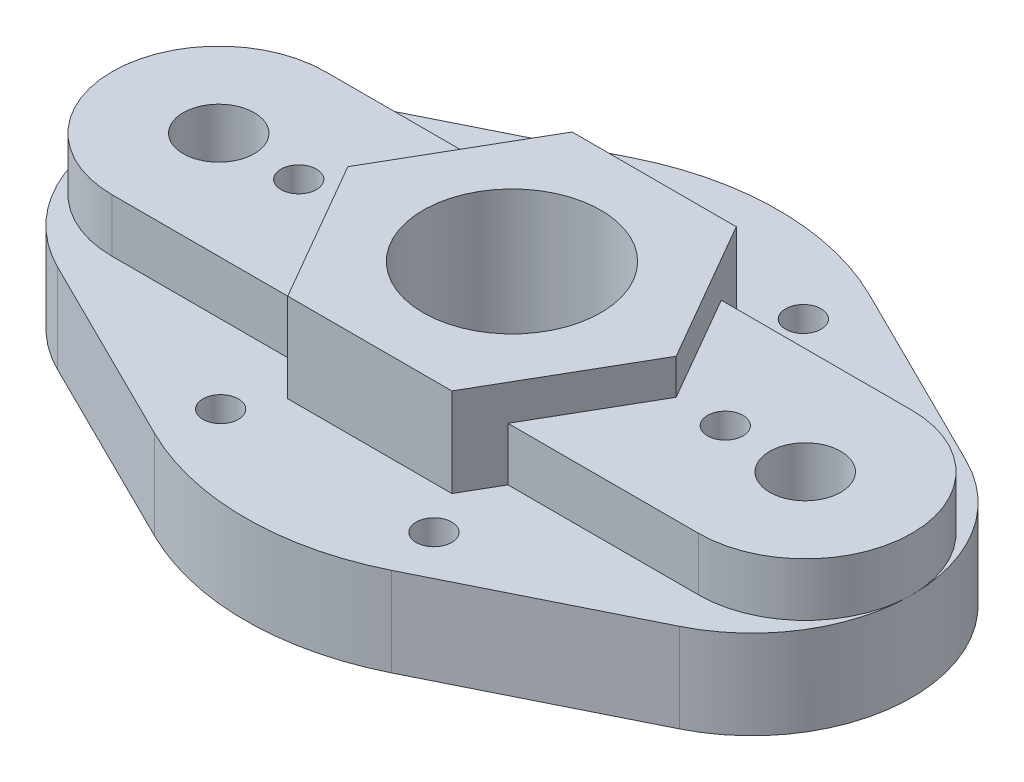
ISO-10303-21;
HEADER;
FILE_DESCRIPTION(('STEP AP214'),'2;1');
FILE_NAME('part.step','',(''),(''),'','','');
FILE_SCHEMA(('AUTOMOTIVE_DESIGN { 1 0 10303 214 1 1 1 1 }'));
ENDSEC;
DATA;
#1=APPLICATION_CONTEXT('core data for automotive mechanical design processes');
#2=APPLICATION_PROTOCOL_DEFINITION('international standard','automotive_design',2000,#1);
#3=PRODUCT_CONTEXT('',#1,'mechanical');
#4=PRODUCT('Part','Part','',(#3));
#5=PRODUCT_RELATED_PRODUCT_CATEGORY('part','',(#4));
#6=PRODUCT_DEFINITION_FORMATION('','',#4);
#7=PRODUCT_DEFINITION_CONTEXT('part definition',#1,'design');
#8=PRODUCT_DEFINITION('design','',#6,#7);
#9=PRODUCT_DEFINITION_SHAPE('','',#8);
#10=(LENGTH_UNIT() NAMED_UNIT(*) SI_UNIT(.MILLI.,.METRE.));
#11=(NAMED_UNIT(*) PLANE_ANGLE_UNIT() SI_UNIT($,.RADIAN.));
#12=(NAMED_UNIT(*) SI_UNIT($,.STERADIAN.) SOLID_ANGLE_UNIT());
#13=UNCERTAINTY_MEASURE_WITH_UNIT(LENGTH_MEASURE(1.E-05),#10,'distance_accuracy_value','');
#14=(GEOMETRIC_REPRESENTATION_CONTEXT(3) GLOBAL_UNCERTAINTY_ASSIGNED_CONTEXT((#13)) GLOBAL_UNIT_ASSIGNED_CONTEXT((#10,
#11,#12)) REPRESENTATION_CONTEXT('',''));
#15=CARTESIAN_POINT('',(0.,0.,0.));
#16=DIRECTION('',(0.,0.,1.));
#17=DIRECTION('',(1.,0.,0.));
#18=AXIS2_PLACEMENT_3D('',#15,#16,#17);
#19=CARTESIAN_POINT('',(-27.,10.,0.));
#20=DIRECTION('',(0.,-1.,0.));
#21=DIRECTION('',(0.,0.,-1.));
#22=AXIS2_PLACEMENT_3D('',#19,#20,#21);
#23=CYLINDRICAL_SURFACE('',#22,18.);
#24=CARTESIAN_POINT('',(-27.,0.,0.));
#25=DIRECTION('',(0.,1.,0.));
#26=DIRECTION('',(0.,0.,1.));
#27=AXIS2_PLACEMENT_3D('',#24,#25,#26);
#28=CIRCLE('',#27,18.);
#29=CARTESIAN_POINT('',(-35.,0.,16.1245154965971));
#30=VERTEX_POINT('',#29);
#31=CARTESIAN_POINT('',(-35.,0.,-16.1245154965971));
#32=VERTEX_POINT('',#31);
#33=EDGE_CURVE('E433',#30,#32,#28,.F.);
#34=ORIENTED_EDGE('',*,*,#33,.F.);
#35=DIRECTION('',(0.,-1.,0.));
#36=VECTOR('',#35,1.);
#37=CARTESIAN_POINT('',(-35.,10.,16.1245154965971));
#38=LINE('',#37,#36);
#39=CARTESIAN_POINT('',(-35.,10.,16.1245154965971));
#40=VERTEX_POINT('',#39);
#41=EDGE_CURVE('E12',#40,#30,#38,.T.);
#42=ORIENTED_EDGE('',*,*,#41,.F.);
#43=CARTESIAN_POINT('',(-27.,10.,0.));
#44=DIRECTION('',(0.,1.,0.));
#45=DIRECTION('',(0.,0.,1.));
#46=AXIS2_PLACEMENT_3D('',#43,#44,#45);
#47=CIRCLE('',#46,18.);
#48=CARTESIAN_POINT('',(-45.,10.,0.));
#49=VERTEX_POINT('',#48);
#50=EDGE_CURVE('E458',#40,#49,#47,.F.);
#51=ORIENTED_EDGE('',*,*,#50,.T.);
#52=CARTESIAN_POINT('',(-27.,10.,0.));
#53=DIRECTION('',(0.,1.,0.));
#54=DIRECTION('',(0.,0.,1.));
#55=AXIS2_PLACEMENT_3D('',#52,#53,#54);
#56=CIRCLE('',#55,18.);
#57=CARTESIAN_POINT('',(-35.,10.,-16.1245154965971));
#58=VERTEX_POINT('',#57);
#59=EDGE_CURVE('E330',#49,#58,#56,.F.);
#60=ORIENTED_EDGE('',*,*,#59,.T.);
#61=DIRECTION('',(0.,-1.,0.));
#62=VECTOR('',#61,1.);
#63=CARTESIAN_POINT('',(-35.,10.,-16.1245154965971));
#64=LINE('',#63,#62);
#65=EDGE_CURVE('E355',#58,#32,#64,.T.);
#66=ORIENTED_EDGE('',*,*,#65,.T.);
#67=EDGE_LOOP('',(#34,#42,#51,#60,#66));
#68=FACE_BOUND('',#67,.T.);
#69=ADVANCED_FACE('F119',(#68),#23,.T.);
#70=CARTESIAN_POINT('',(-13.3333333333333,10.,26.8741924943285));
#71=DIRECTION('',(0.444444444444444,0.,-0.895806416477617));
#72=DIRECTION('',(-0.895806416477617,0.,-0.444444444444444));
#73=AXIS2_PLACEMENT_3D('',#70,#71,#72);
#74=PLANE('',#73);
#75=DIRECTION('',(0.895806416477617,0.,0.444444444444444));
#76=VECTOR('',#75,1.);
#77=CARTESIAN_POINT('',(-13.3333333333333,0.,26.8741924943285));
#78=LINE('',#77,#76);
#79=CARTESIAN_POINT('',(-13.3333333333333,0.,26.8741924943285));
#80=VERTEX_POINT('',#79);
#81=EDGE_CURVE('E480',#30,#80,#78,.T.);
#82=ORIENTED_EDGE('',*,*,#81,.T.);
#83=DIRECTION('',(0.,-1.,0.));
#84=VECTOR('',#83,1.);
#85=CARTESIAN_POINT('',(-13.3333333333333,10.,26.8741924943285));
#86=LINE('',#85,#84);
#87=CARTESIAN_POINT('',(-13.3333333333333,10.,26.8741924943285));
#88=VERTEX_POINT('',#87);
#89=EDGE_CURVE('E128',#88,#80,#86,.T.);
#90=ORIENTED_EDGE('',*,*,#89,.F.);
#91=DIRECTION('',(0.895806416477617,0.,0.444444444444444));
#92=VECTOR('',#91,1.);
#93=CARTESIAN_POINT('',(-13.3333333333333,10.,26.8741924943285));
#94=LINE('',#93,#92);
#95=EDGE_CURVE('E462',#40,#88,#94,.T.);
#96=ORIENTED_EDGE('',*,*,#95,.F.);
#97=ORIENTED_EDGE('',*,*,#41,.T.);
#98=EDGE_LOOP('',(#82,#90,#96,#97));
#99=FACE_BOUND('',#98,.T.);
#100=ADVANCED_FACE('F621',(#99),#74,.F.);
#101=CARTESIAN_POINT('',(0.,10.,0.));
#102=DIRECTION('',(0.,-1.,0.));
#103=DIRECTION('',(0.,0.,-1.));
#104=AXIS2_PLACEMENT_3D('',#101,#102,#103);
#105=CYLINDRICAL_SURFACE('',#104,30.);
#106=CARTESIAN_POINT('',(0.,0.,0.));
#107=DIRECTION('',(0.,1.,0.));
#108=DIRECTION('',(0.,0.,1.));
#109=AXIS2_PLACEMENT_3D('',#106,#107,#108);
#110=CIRCLE('',#109,30.);
#111=CARTESIAN_POINT('',(13.3333333333333,0.,26.8741924943285));
#112=VERTEX_POINT('',#111);
#113=EDGE_CURVE('E484',#112,#80,#110,.F.);
#114=ORIENTED_EDGE('',*,*,#113,.F.);
#115=DIRECTION('',(0.,-1.,0.));
#116=VECTOR('',#115,1.);
#117=CARTESIAN_POINT('',(13.3333333333333,10.,26.8741924943285));
#118=LINE('',#117,#116);
#119=CARTESIAN_POINT('',(13.3333333333333,10.,26.8741924943285));
#120=VERTEX_POINT('',#119);
#121=EDGE_CURVE('E496',#120,#112,#118,.T.);
#122=ORIENTED_EDGE('',*,*,#121,.F.);
#123=CARTESIAN_POINT('',(0.,10.,0.));
#124=DIRECTION('',(0.,1.,0.));
#125=DIRECTION('',(0.,0.,1.));
#126=AXIS2_PLACEMENT_3D('',#123,#124,#125);
#127=CIRCLE('',#126,30.);
#128=EDGE_CURVE('E465',#120,#88,#127,.F.);
#129=ORIENTED_EDGE('',*,*,#128,.T.);
#130=ORIENTED_EDGE('',*,*,#89,.T.);
#131=EDGE_LOOP('',(#114,#122,#129,#130));
#132=FACE_BOUND('',#131,.T.);
#133=ADVANCED_FACE('F662',(#132),#105,.T.);
#134=CARTESIAN_POINT('',(13.3333333333333,10.,26.8741924943285));
#135=DIRECTION('',(0.444444444444444,0.,0.895806416477617));
#136=DIRECTION('',(0.895806416477617,0.,-0.444444444444444));
#137=AXIS2_PLACEMENT_3D('',#134,#135,#136);
#138=PLANE('',#137);
#139=DIRECTION('',(-0.895806416477617,0.,0.444444444444444));
#140=VECTOR('',#139,1.);
#141=CARTESIAN_POINT('',(13.3333333333333,0.,26.8741924943285));
#142=LINE('',#141,#140);
#143=CARTESIAN_POINT('',(35.,0.,16.1245154965971));
#144=VERTEX_POINT('',#143);
#145=EDGE_CURVE('E488',#144,#112,#142,.T.);
#146=ORIENTED_EDGE('',*,*,#145,.F.);
#147=DIRECTION('',(0.,-1.,0.));
#148=VECTOR('',#147,1.);
#149=CARTESIAN_POINT('',(35.,10.,16.1245154965971));
#150=LINE('',#149,#148);
#151=CARTESIAN_POINT('',(35.,10.,16.1245154965971));
#152=VERTEX_POINT('',#151);
#153=EDGE_CURVE('E477',#152,#144,#150,.T.);
#154=ORIENTED_EDGE('',*,*,#153,.F.);
#155=DIRECTION('',(-0.895806416477617,0.,0.444444444444444));
#156=VECTOR('',#155,1.);
#157=CARTESIAN_POINT('',(13.3333333333333,10.,26.8741924943285));
#158=LINE('',#157,#156);
#159=EDGE_CURVE('E469',#152,#120,#158,.T.);
#160=ORIENTED_EDGE('',*,*,#159,.T.);
#161=ORIENTED_EDGE('',*,*,#121,.T.);
#162=EDGE_LOOP('',(#146,#154,#160,#161));
#163=FACE_BOUND('',#162,.T.);
#164=ADVANCED_FACE('F627',(#163),#138,.T.);
#165=CARTESIAN_POINT('',(27.,10.,0.));
#166=DIRECTION('',(0.,-1.,0.));
#167=DIRECTION('',(0.,0.,-1.));
#168=AXIS2_PLACEMENT_3D('',#165,#166,#167);
#169=CYLINDRICAL_SURFACE('',#168,18.);
#170=CARTESIAN_POINT('',(27.,0.,0.));
#171=DIRECTION('',(0.,1.,0.));
#172=DIRECTION('',(0.,0.,1.));
#173=AXIS2_PLACEMENT_3D('',#170,#171,#172);
#174=CIRCLE('',#173,18.);
#175=CARTESIAN_POINT('',(35.,0.,-16.1245154965971));
#176=VERTEX_POINT('',#175);
#177=EDGE_CURVE('E439',#144,#176,#174,.T.);
#178=ORIENTED_EDGE('',*,*,#177,.T.);
#179=DIRECTION('',(0.,-1.,0.));
#180=VECTOR('',#179,1.);
#181=CARTESIAN_POINT('',(35.,10.,-16.1245154965971));
#182=LINE('',#181,#180);
#183=CARTESIAN_POINT('',(35.,10.,-16.1245154965971));
#184=VERTEX_POINT('',#183);
#185=EDGE_CURVE('E366',#184,#176,#182,.T.);
#186=ORIENTED_EDGE('',*,*,#185,.F.);
#187=CARTESIAN_POINT('',(27.,10.,0.));
#188=DIRECTION('',(0.,1.,0.));
#189=DIRECTION('',(0.,0.,1.));
#190=AXIS2_PLACEMENT_3D('',#187,#188,#189);
#191=CIRCLE('',#190,18.);
#192=CARTESIAN_POINT('',(45.,10.,0.));
#193=VERTEX_POINT('',#192);
#194=EDGE_CURVE('E316',#193,#184,#191,.T.);
#195=ORIENTED_EDGE('',*,*,#194,.F.);
#196=CARTESIAN_POINT('',(27.,10.,0.));
#197=DIRECTION('',(0.,1.,0.));
#198=DIRECTION('',(0.,0.,1.));
#199=AXIS2_PLACEMENT_3D('',#196,#197,#198);
#200=CIRCLE('',#199,18.);
#201=EDGE_CURVE('E473',#152,#193,#200,.T.);
#202=ORIENTED_EDGE('',*,*,#201,.F.);
#203=ORIENTED_EDGE('',*,*,#153,.T.);
#204=EDGE_LOOP('',(#178,#186,#195,#202,#203));
#205=FACE_BOUND('',#204,.T.);
#206=ADVANCED_FACE('F631',(#205),#169,.T.);
#207=CARTESIAN_POINT('',(0.,10.,0.));
#208=DIRECTION('',(0.,1.,0.));
#209=DIRECTION('',(0.,0.,1.));
#210=AXIS2_PLACEMENT_3D('',#207,#208,#209);
#211=PLANE('',#210);
#212=CARTESIAN_POINT('',(12.,10.,20.7846096908266));
#213=DIRECTION('',(0.,1.,0.));
#214=DIRECTION('',(0.,0.,1.));
#215=AXIS2_PLACEMENT_3D('',#212,#213,#214);
#216=CIRCLE('',#215,2.);
#217=CARTESIAN_POINT('',(12.,10.,22.7846096908266));
#218=VERTEX_POINT('',#217);
#219=EDGE_CURVE('E296',#218,#218,#216,.T.);
#220=ORIENTED_EDGE('',*,*,#219,.F.);
#221=EDGE_LOOP('',(#220));
#222=FACE_BOUND('',#221,.T.);
#223=CARTESIAN_POINT('',(-12.0000000000001,10.,20.7846096908265));
#224=DIRECTION('',(0.,1.,0.));
#225=DIRECTION('',(0.,0.,1.));
#226=AXIS2_PLACEMENT_3D('',#223,#224,#225);
#227=CIRCLE('',#226,2.);
#228=CARTESIAN_POINT('',(-12.0000000000001,10.,22.7846096908265));
#229=VERTEX_POINT('',#228);
#230=EDGE_CURVE('E524',#229,#229,#227,.T.);
#231=ORIENTED_EDGE('',*,*,#230,.F.);
#232=EDGE_LOOP('',(#231));
#233=FACE_BOUND('',#232,.T.);
#234=CARTESIAN_POINT('',(33.,10.,0.));
#235=DIRECTION('',(0.,1.,0.));
#236=DIRECTION('',(0.,0.,1.));
#237=AXIS2_PLACEMENT_3D('',#234,#235,#236);
#238=CIRCLE('',#237,12.);
#239=CARTESIAN_POINT('',(33.,10.,12.));
#240=VERTEX_POINT('',#239);
#241=EDGE_CURVE('E434',#240,#193,#238,.T.);
#242=ORIENTED_EDGE('',*,*,#241,.F.);
#243=DIRECTION('',(1.,0.,0.));
#244=VECTOR('',#243,1.);
#245=CARTESIAN_POINT('',(0.,10.,12.));
#246=LINE('',#245,#244);
#247=CARTESIAN_POINT('',(11.5470053837925,10.,12.));
#248=VERTEX_POINT('',#247);
#249=EDGE_CURVE('E438',#248,#240,#246,.T.);
#250=ORIENTED_EDGE('',*,*,#249,.F.);
#251=DIRECTION('',(0.499999999999999,0.,-0.866025403784439));
#252=VECTOR('',#251,1.);
#253=CARTESIAN_POINT('',(13.856406460551,10.,7.99999999999999));
#254=LINE('',#253,#252);
#255=CARTESIAN_POINT('',(9.23760430703402,10.,16.));
#256=VERTEX_POINT('',#255);
#257=EDGE_CURVE('E442',#256,#248,#254,.T.);
#258=ORIENTED_EDGE('',*,*,#257,.F.);
#259=DIRECTION('',(1.,0.,0.));
#260=VECTOR('',#259,1.);
#261=CARTESIAN_POINT('',(0.,10.,16.));
#262=LINE('',#261,#260);
#263=CARTESIAN_POINT('',(-9.23760430703401,10.,16.));
#264=VERTEX_POINT('',#263);
#265=EDGE_CURVE('E447',#264,#256,#262,.T.);
#266=ORIENTED_EDGE('',*,*,#265,.F.);
#267=DIRECTION('',(0.5,0.,0.866025403784439));
#268=VECTOR('',#267,1.);
#269=CARTESIAN_POINT('',(-13.856406460551,10.,8.));
#270=LINE('',#269,#268);
#271=CARTESIAN_POINT('',(-11.5470053837925,10.,12.));
#272=VERTEX_POINT('',#271);
#273=EDGE_CURVE('E451',#272,#264,#270,.T.);
#274=ORIENTED_EDGE('',*,*,#273,.F.);
#275=CARTESIAN_POINT('',(-33.,10.,12.));
#276=VERTEX_POINT('',#275);
#277=EDGE_CURVE('E443',#276,#272,#246,.T.);
#278=ORIENTED_EDGE('',*,*,#277,.F.);
#279=CARTESIAN_POINT('',(-33.,10.,0.));
#280=DIRECTION('',(0.,1.,0.));
#281=DIRECTION('',(0.,0.,1.));
#282=AXIS2_PLACEMENT_3D('',#279,#280,#281);
#283=CIRCLE('',#282,12.);
#284=EDGE_CURVE('E455',#49,#276,#283,.T.);
#285=ORIENTED_EDGE('',*,*,#284,.F.);
#286=ORIENTED_EDGE('',*,*,#50,.F.);
#287=ORIENTED_EDGE('',*,*,#95,.T.);
#288=ORIENTED_EDGE('',*,*,#128,.F.);
#289=ORIENTED_EDGE('',*,*,#159,.F.);
#290=ORIENTED_EDGE('',*,*,#201,.T.);
#291=EDGE_LOOP('',(#242,#250,#258,#266,#274,#278,#285,#286,#287,#288,#289,#290));
#292=FACE_BOUND('',#291,.T.);
#293=ADVANCED_FACE('F573',(#222,#233,#292),#211,.T.);
#294=CARTESIAN_POINT('',(0.,0.,0.));
#295=DIRECTION('',(0.,1.,0.));
#296=DIRECTION('',(0.,0.,1.));
#297=AXIS2_PLACEMENT_3D('',#294,#295,#296);
#298=PLANE('',#297);
#299=CARTESIAN_POINT('',(12.,0.,20.7846096908266));
#300=DIRECTION('',(0.,1.,0.));
#301=DIRECTION('',(0.,0.,1.));
#302=AXIS2_PLACEMENT_3D('',#299,#300,#301);
#303=CIRCLE('',#302,2.);
#304=CARTESIAN_POINT('',(12.,0.,22.7846096908266));
#305=VERTEX_POINT('',#304);
#306=EDGE_CURVE('E998',#305,#305,#303,.T.);
#307=ORIENTED_EDGE('',*,*,#306,.T.);
#308=EDGE_LOOP('',(#307));
#309=FACE_BOUND('',#308,.T.);
#310=CARTESIAN_POINT('',(24.,0.,0.));
#311=DIRECTION('',(0.,1.,0.));
#312=DIRECTION('',(0.,0.,1.));
#313=AXIS2_PLACEMENT_3D('',#310,#311,#312);
#314=CIRCLE('',#313,2.);
#315=CARTESIAN_POINT('',(24.,0.,2.));
#316=VERTEX_POINT('',#315);
#317=EDGE_CURVE('E993',#316,#316,#314,.T.);
#318=ORIENTED_EDGE('',*,*,#317,.T.);
#319=EDGE_LOOP('',(#318));
#320=FACE_BOUND('',#319,.T.);
#321=CARTESIAN_POINT('',(-33.,0.,2.30757874681352E-13));
#322=DIRECTION('',(0.,1.,0.));
#323=DIRECTION('',(0.,0.,-1.));
#324=AXIS2_PLACEMENT_3D('',#321,#322,#323);
#325=CIRCLE('',#324,4.);
#326=CARTESIAN_POINT('',(-33.,0.,-3.99999999999977));
#327=VERTEX_POINT('',#326);
#328=EDGE_CURVE('E997',#327,#327,#325,.T.);
#329=ORIENTED_EDGE('',*,*,#328,.T.);
#330=EDGE_LOOP('',(#329));
#331=FACE_BOUND('',#330,.T.);
#332=CARTESIAN_POINT('',(33.,0.,2.30757874681352E-13));
#333=DIRECTION('',(0.,1.,0.));
#334=DIRECTION('',(0.,0.,1.));
#335=AXIS2_PLACEMENT_3D('',#332,#333,#334);
#336=CIRCLE('',#335,4.);
#337=CARTESIAN_POINT('',(33.,0.,4.00000000000023));
#338=VERTEX_POINT('',#337);
#339=EDGE_CURVE('E1003',#338,#338,#336,.T.);
#340=ORIENTED_EDGE('',*,*,#339,.T.);
#341=EDGE_LOOP('',(#340));
#342=FACE_BOUND('',#341,.T.);
#343=CARTESIAN_POINT('',(-12.0000000000001,0.,20.7846096908265));
#344=DIRECTION('',(0.,1.,0.));
#345=DIRECTION('',(0.,0.,1.));
#346=AXIS2_PLACEMENT_3D('',#343,#344,#345);
#347=CIRCLE('',#346,2.);
#348=CARTESIAN_POINT('',(-12.0000000000001,0.,22.7846096908265));
#349=VERTEX_POINT('',#348);
#350=EDGE_CURVE('E1002',#349,#349,#347,.T.);
#351=ORIENTED_EDGE('',*,*,#350,.T.);
#352=EDGE_LOOP('',(#351));
#353=FACE_BOUND('',#352,.T.);
#354=CARTESIAN_POINT('',(-24.,0.,-1.6759110426447E-13));
#355=DIRECTION('',(0.,1.,0.));
#356=DIRECTION('',(0.,0.,1.));
#357=AXIS2_PLACEMENT_3D('',#354,#355,#356);
#358=CIRCLE('',#357,2.);
#359=CARTESIAN_POINT('',(-24.,0.,1.99999999999983));
#360=VERTEX_POINT('',#359);
#361=EDGE_CURVE('E989',#360,#360,#358,.T.);
#362=ORIENTED_EDGE('',*,*,#361,.T.);
#363=EDGE_LOOP('',(#362));
#364=FACE_BOUND('',#363,.T.);
#365=CARTESIAN_POINT('',(-11.9999999999998,0.,-20.7846096908266));
#366=DIRECTION('',(0.,1.,0.));
#367=DIRECTION('',(0.,0.,1.));
#368=AXIS2_PLACEMENT_3D('',#365,#366,#367);
#369=CIRCLE('',#368,2.);
#370=CARTESIAN_POINT('',(-11.9999999999998,0.,-18.7846096908266));
#371=VERTEX_POINT('',#370);
#372=EDGE_CURVE('E985',#371,#371,#369,.T.);
#373=ORIENTED_EDGE('',*,*,#372,.T.);
#374=EDGE_LOOP('',(#373));
#375=FACE_BOUND('',#374,.T.);
#376=CARTESIAN_POINT('',(12.0000000000002,0.,-20.7846096908264));
#377=DIRECTION('',(0.,1.,0.));
#378=DIRECTION('',(0.,0.,1.));
#379=AXIS2_PLACEMENT_3D('',#376,#377,#378);
#380=CIRCLE('',#379,2.);
#381=CARTESIAN_POINT('',(12.0000000000002,0.,-18.7846096908264));
#382=VERTEX_POINT('',#381);
#383=EDGE_CURVE('E982',#382,#382,#380,.T.);
#384=ORIENTED_EDGE('',*,*,#383,.T.);
#385=EDGE_LOOP('',(#384));
#386=FACE_BOUND('',#385,.T.);
#387=CARTESIAN_POINT('',(0.,0.,0.));
#388=DIRECTION('',(0.,1.,0.));
#389=DIRECTION('',(0.,0.,1.));
#390=AXIS2_PLACEMENT_3D('',#387,#388,#389);
#391=CIRCLE('',#390,10.);
#392=CARTESIAN_POINT('',(0.,0.,10.));
#393=VERTEX_POINT('',#392);
#394=EDGE_CURVE('E506',#393,#393,#391,.T.);
#395=ORIENTED_EDGE('',*,*,#394,.T.);
#396=EDGE_LOOP('',(#395));
#397=FACE_BOUND('',#396,.T.);
#398=ORIENTED_EDGE('',*,*,#33,.T.);
#399=DIRECTION('',(0.895806416477617,0.,-0.444444444444444));
#400=VECTOR('',#399,1.);
#401=CARTESIAN_POINT('',(-13.3333333333333,0.,-26.8741924943285));
#402=LINE('',#401,#400);
#403=CARTESIAN_POINT('',(-13.3333333333333,0.,-26.8741924943285));
#404=VERTEX_POINT('',#403);
#405=EDGE_CURVE('E317',#32,#404,#402,.T.);
#406=ORIENTED_EDGE('',*,*,#405,.T.);
#407=CARTESIAN_POINT('',(0.,0.,0.));
#408=DIRECTION('',(0.,1.,0.));
#409=DIRECTION('',(0.,0.,1.));
#410=AXIS2_PLACEMENT_3D('',#407,#408,#409);
#411=CIRCLE('',#410,30.);
#412=CARTESIAN_POINT('',(13.3333333333333,0.,-26.8741924943285));
#413=VERTEX_POINT('',#412);
#414=EDGE_CURVE('E306',#413,#404,#411,.T.);
#415=ORIENTED_EDGE('',*,*,#414,.F.);
#416=DIRECTION('',(-0.895806416477617,0.,-0.444444444444444));
#417=VECTOR('',#416,1.);
#418=CARTESIAN_POINT('',(13.3333333333333,0.,-26.8741924943285));
#419=LINE('',#418,#417);
#420=EDGE_CURVE('E302',#176,#413,#419,.T.);
#421=ORIENTED_EDGE('',*,*,#420,.F.);
#422=ORIENTED_EDGE('',*,*,#177,.F.);
#423=ORIENTED_EDGE('',*,*,#145,.T.);
#424=ORIENTED_EDGE('',*,*,#113,.T.);
#425=ORIENTED_EDGE('',*,*,#81,.F.);
#426=EDGE_LOOP('',(#398,#406,#415,#421,#422,#423,#424,#425));
#427=FACE_BOUND('',#426,.T.);
#428=ADVANCED_FACE('F616',(#309,#320,#331,#342,#353,#364,#375,#386,#397,#427),#298,.F.);
#429=CARTESIAN_POINT('',(0.,16.,-12.));
#430=DIRECTION('',(0.,0.,-1.));
#431=DIRECTION('',(-1.,0.,0.));
#432=AXIS2_PLACEMENT_3D('',#429,#430,#431);
#433=PLANE('',#432);
#434=DIRECTION('',(1.,0.,0.));
#435=VECTOR('',#434,1.);
#436=CARTESIAN_POINT('',(0.,10.,-12.));
#437=LINE('',#436,#435);
#438=CARTESIAN_POINT('',(-33.,10.,-12.));
#439=VERTEX_POINT('',#438);
#440=CARTESIAN_POINT('',(-11.5470053837925,10.,-12.));
#441=VERTEX_POINT('',#440);
#442=EDGE_CURVE('E136',#439,#441,#437,.T.);
#443=ORIENTED_EDGE('',*,*,#442,.F.);
#444=DIRECTION('',(0.,-1.,0.));
#445=VECTOR('',#444,1.);
#446=CARTESIAN_POINT('',(-33.,16.,-12.));
#447=LINE('',#446,#445);
#448=CARTESIAN_POINT('',(-33.,16.,-12.));
#449=VERTEX_POINT('',#448);
#450=EDGE_CURVE('E430',#449,#439,#447,.T.);
#451=ORIENTED_EDGE('',*,*,#450,.F.);
#452=DIRECTION('',(1.,0.,0.));
#453=VECTOR('',#452,1.);
#454=CARTESIAN_POINT('',(0.,16.,-12.));
#455=LINE('',#454,#453);
#456=CARTESIAN_POINT('',(-11.5470053837925,16.,-12.));
#457=VERTEX_POINT('',#456);
#458=EDGE_CURVE('E404',#449,#457,#455,.T.);
#459=ORIENTED_EDGE('',*,*,#458,.T.);
#460=DIRECTION('',(0.,-1.,0.));
#461=VECTOR('',#460,1.);
#462=CARTESIAN_POINT('',(-11.5470053837925,16.,-12.));
#463=LINE('',#462,#461);
#464=EDGE_CURVE('E141',#457,#441,#463,.T.);
#465=ORIENTED_EDGE('',*,*,#464,.T.);
#466=EDGE_LOOP('',(#443,#451,#459,#465));
#467=FACE_BOUND('',#466,.T.);
#468=ADVANCED_FACE('F672',(#467),#433,.T.);
#469=CARTESIAN_POINT('',(-33.,16.,0.));
#470=DIRECTION('',(0.,-1.,0.));
#471=DIRECTION('',(0.,0.,-1.));
#472=AXIS2_PLACEMENT_3D('',#469,#470,#471);
#473=CYLINDRICAL_SURFACE('',#472,12.);
#474=ORIENTED_EDGE('',*,*,#450,.T.);
#475=CARTESIAN_POINT('',(-33.,10.,0.));
#476=DIRECTION('',(0.,1.,0.));
#477=DIRECTION('',(0.,0.,1.));
#478=AXIS2_PLACEMENT_3D('',#475,#476,#477);
#479=CIRCLE('',#478,12.);
#480=EDGE_CURVE('E334',#439,#49,#479,.T.);
#481=ORIENTED_EDGE('',*,*,#480,.T.);
#482=ORIENTED_EDGE('',*,*,#284,.T.);
#483=DIRECTION('',(0.,-1.,0.));
#484=VECTOR('',#483,1.);
#485=CARTESIAN_POINT('',(-33.,16.,12.));
#486=LINE('',#485,#484);
#487=CARTESIAN_POINT('',(-33.,16.,12.));
#488=VERTEX_POINT('',#487);
#489=EDGE_CURVE('E426',#488,#276,#486,.T.);
#490=ORIENTED_EDGE('',*,*,#489,.F.);
#491=CARTESIAN_POINT('',(-33.,16.,0.));
#492=DIRECTION('',(0.,1.,0.));
#493=DIRECTION('',(0.,0.,1.));
#494=AXIS2_PLACEMENT_3D('',#491,#492,#493);
#495=CIRCLE('',#494,12.);
#496=EDGE_CURVE('E407',#449,#488,#495,.T.);
#497=ORIENTED_EDGE('',*,*,#496,.F.);
#498=EDGE_LOOP('',(#474,#481,#482,#490,#497));
#499=FACE_BOUND('',#498,.T.);
#500=ADVANCED_FACE('F600',(#499),#473,.T.);
#501=CARTESIAN_POINT('',(0.,16.,12.));
#502=DIRECTION('',(0.,0.,-1.));
#503=DIRECTION('',(-1.,0.,0.));
#504=AXIS2_PLACEMENT_3D('',#501,#502,#503);
#505=PLANE('',#504);
#506=ORIENTED_EDGE('',*,*,#277,.T.);
#507=DIRECTION('',(0.,-1.,0.));
#508=VECTOR('',#507,1.);
#509=CARTESIAN_POINT('',(-11.5470053837925,16.,12.));
#510=LINE('',#509,#508);
#511=CARTESIAN_POINT('',(-11.5470053837925,16.,12.));
#512=VERTEX_POINT('',#511);
#513=EDGE_CURVE('E422',#512,#272,#510,.T.);
#514=ORIENTED_EDGE('',*,*,#513,.F.);
#515=DIRECTION('',(1.,0.,0.));
#516=VECTOR('',#515,1.);
#517=CARTESIAN_POINT('',(0.,16.,12.));
#518=LINE('',#517,#516);
#519=EDGE_CURVE('E410',#488,#512,#518,.T.);
#520=ORIENTED_EDGE('',*,*,#519,.F.);
#521=ORIENTED_EDGE('',*,*,#489,.T.);
#522=EDGE_LOOP('',(#506,#514,#520,#521));
#523=FACE_BOUND('',#522,.T.);
#524=ADVANCED_FACE('F595',(#523),#505,.F.);
#525=CARTESIAN_POINT('',(0.,16.,0.));
#526=DIRECTION('',(0.,1.,0.));
#527=DIRECTION('',(0.,0.,1.));
#528=AXIS2_PLACEMENT_3D('',#525,#526,#527);
#529=PLANE('',#528);
#530=CARTESIAN_POINT('',(-33.,16.,2.30757874681352E-13));
#531=DIRECTION('',(0.,1.,0.));
#532=DIRECTION('',(0.,0.,1.));
#533=AXIS2_PLACEMENT_3D('',#530,#531,#532);
#534=CIRCLE('',#533,4.);
#535=CARTESIAN_POINT('',(-33.,16.,4.00000000000023));
#536=VERTEX_POINT('',#535);
#537=EDGE_CURVE('E122',#536,#536,#534,.T.);
#538=ORIENTED_EDGE('',*,*,#537,.F.);
#539=EDGE_LOOP('',(#538));
#540=FACE_BOUND('',#539,.T.);
#541=CARTESIAN_POINT('',(-24.,16.,-1.6759110426447E-13));
#542=DIRECTION('',(0.,1.,0.));
#543=DIRECTION('',(0.,0.,1.));
#544=AXIS2_PLACEMENT_3D('',#541,#542,#543);
#545=CIRCLE('',#544,2.);
#546=CARTESIAN_POINT('',(-24.,16.,1.99999999999983));
#547=VERTEX_POINT('',#546);
#548=EDGE_CURVE('E517',#547,#547,#545,.T.);
#549=ORIENTED_EDGE('',*,*,#548,.F.);
#550=EDGE_LOOP('',(#549));
#551=FACE_BOUND('',#550,.T.);
#552=ORIENTED_EDGE('',*,*,#458,.F.);
#553=ORIENTED_EDGE('',*,*,#496,.T.);
#554=ORIENTED_EDGE('',*,*,#519,.T.);
#555=DIRECTION('',(0.5,0.,0.866025403784439));
#556=VECTOR('',#555,1.);
#557=CARTESIAN_POINT('',(-13.856406460551,16.,8.));
#558=LINE('',#557,#556);
#559=CARTESIAN_POINT('',(-18.475208614068,16.,0.));
#560=VERTEX_POINT('',#559);
#561=EDGE_CURVE('E413',#560,#512,#558,.T.);
#562=ORIENTED_EDGE('',*,*,#561,.F.);
#563=DIRECTION('',(-0.5,0.,0.866025403784439));
#564=VECTOR('',#563,1.);
#565=CARTESIAN_POINT('',(-13.856406460551,16.,-8.));
#566=LINE('',#565,#564);
#567=EDGE_CURVE('E417',#457,#560,#566,.T.);
#568=ORIENTED_EDGE('',*,*,#567,.F.);
#569=EDGE_LOOP('',(#552,#553,#554,#562,#568));
#570=FACE_BOUND('',#569,.T.);
#571=ADVANCED_FACE('F683',(#540,#551,#570),#529,.T.);
#572=CARTESIAN_POINT('',(33.,16.,0.));
#573=DIRECTION('',(0.,-1.,0.));
#574=DIRECTION('',(0.,0.,-1.));
#575=AXIS2_PLACEMENT_3D('',#572,#573,#574);
#576=CYLINDRICAL_SURFACE('',#575,12.);
#577=ORIENTED_EDGE('',*,*,#241,.T.);
#578=CARTESIAN_POINT('',(33.,10.,0.));
#579=DIRECTION('',(0.,1.,0.));
#580=DIRECTION('',(0.,0.,1.));
#581=AXIS2_PLACEMENT_3D('',#578,#579,#580);
#582=CIRCLE('',#581,12.);
#583=CARTESIAN_POINT('',(33.,10.,-12.));
#584=VERTEX_POINT('',#583);
#585=EDGE_CURVE('E312',#193,#584,#582,.T.);
#586=ORIENTED_EDGE('',*,*,#585,.T.);
#587=DIRECTION('',(0.,-1.,0.));
#588=VECTOR('',#587,1.);
#589=CARTESIAN_POINT('',(33.,16.,-12.));
#590=LINE('',#589,#588);
#591=CARTESIAN_POINT('',(33.,16.,-12.));
#592=VERTEX_POINT('',#591);
#593=EDGE_CURVE('E396',#592,#584,#590,.T.);
#594=ORIENTED_EDGE('',*,*,#593,.F.);
#595=CARTESIAN_POINT('',(33.,16.,0.));
#596=DIRECTION('',(0.,1.,0.));
#597=DIRECTION('',(0.,0.,1.));
#598=AXIS2_PLACEMENT_3D('',#595,#596,#597);
#599=CIRCLE('',#598,12.);
#600=CARTESIAN_POINT('',(33.,16.,12.));
#601=VERTEX_POINT('',#600);
#602=EDGE_CURVE('E374',#601,#592,#599,.T.);
#603=ORIENTED_EDGE('',*,*,#602,.F.);
#604=DIRECTION('',(0.,-1.,0.));
#605=VECTOR('',#604,1.);
#606=CARTESIAN_POINT('',(33.,16.,12.));
#607=LINE('',#606,#605);
#608=EDGE_CURVE('E400',#601,#240,#607,.T.);
#609=ORIENTED_EDGE('',*,*,#608,.T.);
#610=EDGE_LOOP('',(#577,#586,#594,#603,#609));
#611=FACE_BOUND('',#610,.T.);
#612=ADVANCED_FACE('F634',(#611),#576,.T.);
#613=CARTESIAN_POINT('',(0.,16.,12.));
#614=DIRECTION('',(0.,0.,-1.));
#615=DIRECTION('',(-1.,0.,0.));
#616=AXIS2_PLACEMENT_3D('',#613,#614,#615);
#617=PLANE('',#616);
#618=ORIENTED_EDGE('',*,*,#249,.T.);
#619=ORIENTED_EDGE('',*,*,#608,.F.);
#620=DIRECTION('',(1.,0.,0.));
#621=VECTOR('',#620,1.);
#622=CARTESIAN_POINT('',(0.,16.,12.));
#623=LINE('',#622,#621);
#624=CARTESIAN_POINT('',(11.5470053837925,16.,12.));
#625=VERTEX_POINT('',#624);
#626=EDGE_CURVE('E370',#625,#601,#623,.T.);
#627=ORIENTED_EDGE('',*,*,#626,.F.);
#628=DIRECTION('',(0.,-1.,0.));
#629=VECTOR('',#628,1.);
#630=CARTESIAN_POINT('',(11.5470053837925,16.,12.));
#631=LINE('',#630,#629);
#632=EDGE_CURVE('E389',#625,#248,#631,.T.);
#633=ORIENTED_EDGE('',*,*,#632,.T.);
#634=EDGE_LOOP('',(#618,#619,#627,#633));
#635=FACE_BOUND('',#634,.T.);
#636=ADVANCED_FACE('F637',(#635),#617,.F.);
#637=CARTESIAN_POINT('',(0.,16.,-12.));
#638=DIRECTION('',(0.,0.,-1.));
#639=DIRECTION('',(-1.,0.,0.));
#640=AXIS2_PLACEMENT_3D('',#637,#638,#639);
#641=PLANE('',#640);
#642=CARTESIAN_POINT('',(11.5470053837925,10.,-12.));
#643=VERTEX_POINT('',#642);
#644=EDGE_CURVE('E340',#643,#584,#437,.T.);
#645=ORIENTED_EDGE('',*,*,#644,.F.);
#646=DIRECTION('',(0.,-1.,0.));
#647=VECTOR('',#646,1.);
#648=CARTESIAN_POINT('',(11.5470053837925,16.,-12.));
#649=LINE('',#648,#647);
#650=CARTESIAN_POINT('',(11.5470053837925,16.,-12.));
#651=VERTEX_POINT('',#650);
#652=EDGE_CURVE('E392',#651,#643,#649,.T.);
#653=ORIENTED_EDGE('',*,*,#652,.F.);
#654=DIRECTION('',(1.,0.,0.));
#655=VECTOR('',#654,1.);
#656=CARTESIAN_POINT('',(0.,16.,-12.));
#657=LINE('',#656,#655);
#658=EDGE_CURVE('E377',#651,#592,#657,.T.);
#659=ORIENTED_EDGE('',*,*,#658,.T.);
#660=ORIENTED_EDGE('',*,*,#593,.T.);
#661=EDGE_LOOP('',(#645,#653,#659,#660));
#662=FACE_BOUND('',#661,.T.);
#663=ADVANCED_FACE('F589',(#662),#641,.T.);
#664=CARTESIAN_POINT('',(0.,16.,0.));
#665=DIRECTION('',(0.,1.,0.));
#666=DIRECTION('',(0.,0.,1.));
#667=AXIS2_PLACEMENT_3D('',#664,#665,#666);
#668=PLANE('',#667);
#669=CARTESIAN_POINT('',(24.,16.,0.));
#670=DIRECTION('',(0.,1.,0.));
#671=DIRECTION('',(0.,0.,1.));
#672=AXIS2_PLACEMENT_3D('',#669,#670,#671);
#673=CIRCLE('',#672,2.);
#674=CARTESIAN_POINT('',(24.,16.,2.));
#675=VERTEX_POINT('',#674);
#676=EDGE_CURVE('E514',#675,#675,#673,.T.);
#677=ORIENTED_EDGE('',*,*,#676,.F.);
#678=EDGE_LOOP('',(#677));
#679=FACE_BOUND('',#678,.T.);
#680=CARTESIAN_POINT('',(33.,16.,2.30757874681352E-13));
#681=DIRECTION('',(0.,1.,0.));
#682=DIRECTION('',(0.,0.,1.));
#683=AXIS2_PLACEMENT_3D('',#680,#681,#682);
#684=CIRCLE('',#683,4.);
#685=CARTESIAN_POINT('',(33.,16.,4.00000000000023));
#686=VERTEX_POINT('',#685);
#687=EDGE_CURVE('E510',#686,#686,#684,.T.);
#688=ORIENTED_EDGE('',*,*,#687,.F.);
#689=EDGE_LOOP('',(#688));
#690=FACE_BOUND('',#689,.T.);
#691=ORIENTED_EDGE('',*,*,#626,.T.);
#692=ORIENTED_EDGE('',*,*,#602,.T.);
#693=ORIENTED_EDGE('',*,*,#658,.F.);
#694=DIRECTION('',(-0.5,0.,-0.866025403784439));
#695=VECTOR('',#694,1.);
#696=CARTESIAN_POINT('',(13.856406460551,16.,-8.));
#697=LINE('',#696,#695);
#698=CARTESIAN_POINT('',(18.475208614068,16.,0.));
#699=VERTEX_POINT('',#698);
#700=EDGE_CURVE('E381',#699,#651,#697,.T.);
#701=ORIENTED_EDGE('',*,*,#700,.F.);
#702=DIRECTION('',(0.499999999999999,0.,-0.866025403784439));
#703=VECTOR('',#702,1.);
#704=CARTESIAN_POINT('',(13.856406460551,16.,7.99999999999999));
#705=LINE('',#704,#703);
#706=EDGE_CURVE('E385',#625,#699,#705,.T.);
#707=ORIENTED_EDGE('',*,*,#706,.F.);
#708=EDGE_LOOP('',(#691,#692,#693,#701,#707));
#709=FACE_BOUND('',#708,.T.);
#710=ADVANCED_FACE('F639',(#679,#690,#709),#668,.T.);
#711=CARTESIAN_POINT('',(13.3333333333333,10.,-26.8741924943285));
#712=DIRECTION('',(-0.444444444444444,0.,0.895806416477617));
#713=DIRECTION('',(0.895806416477617,0.,0.444444444444444));
#714=AXIS2_PLACEMENT_3D('',#711,#712,#713);
#715=PLANE('',#714);
#716=ORIENTED_EDGE('',*,*,#420,.T.);
#717=DIRECTION('',(0.,-1.,0.));
#718=VECTOR('',#717,1.);
#719=CARTESIAN_POINT('',(13.3333333333333,10.,-26.8741924943285));
#720=LINE('',#719,#718);
#721=CARTESIAN_POINT('',(13.3333333333333,10.,-26.8741924943285));
#722=VERTEX_POINT('',#721);
#723=EDGE_CURVE('E362',#722,#413,#720,.T.);
#724=ORIENTED_EDGE('',*,*,#723,.F.);
#725=DIRECTION('',(-0.895806416477617,0.,-0.444444444444444));
#726=VECTOR('',#725,1.);
#727=CARTESIAN_POINT('',(13.3333333333333,10.,-26.8741924943285));
#728=LINE('',#727,#726);
#729=EDGE_CURVE('E320',#184,#722,#728,.T.);
#730=ORIENTED_EDGE('',*,*,#729,.F.);
#731=ORIENTED_EDGE('',*,*,#185,.T.);
#732=EDGE_LOOP('',(#716,#724,#730,#731));
#733=FACE_BOUND('',#732,.T.);
#734=ADVANCED_FACE('F641',(#733),#715,.F.);
#735=CARTESIAN_POINT('',(0.,10.,0.));
#736=DIRECTION('',(0.,-1.,0.));
#737=DIRECTION('',(0.,0.,-1.));
#738=AXIS2_PLACEMENT_3D('',#735,#736,#737);
#739=CYLINDRICAL_SURFACE('',#738,30.);
#740=ORIENTED_EDGE('',*,*,#414,.T.);
#741=DIRECTION('',(0.,-1.,0.));
#742=VECTOR('',#741,1.);
#743=CARTESIAN_POINT('',(-13.3333333333333,10.,-26.8741924943285));
#744=LINE('',#743,#742);
#745=CARTESIAN_POINT('',(-13.3333333333333,10.,-26.8741924943285));
#746=VERTEX_POINT('',#745);
#747=EDGE_CURVE('E359',#746,#404,#744,.T.);
#748=ORIENTED_EDGE('',*,*,#747,.F.);
#749=CARTESIAN_POINT('',(0.,10.,0.));
#750=DIRECTION('',(0.,1.,0.));
#751=DIRECTION('',(0.,0.,1.));
#752=AXIS2_PLACEMENT_3D('',#749,#750,#751);
#753=CIRCLE('',#752,30.);
#754=EDGE_CURVE('E323',#722,#746,#753,.T.);
#755=ORIENTED_EDGE('',*,*,#754,.F.);
#756=ORIENTED_EDGE('',*,*,#723,.T.);
#757=EDGE_LOOP('',(#740,#748,#755,#756));
#758=FACE_BOUND('',#757,.T.);
#759=ADVANCED_FACE('F649',(#758),#739,.T.);
#760=CARTESIAN_POINT('',(-13.3333333333333,10.,-26.8741924943285));
#761=DIRECTION('',(-0.444444444444444,0.,-0.895806416477617));
#762=DIRECTION('',(-0.895806416477617,0.,0.444444444444444));
#763=AXIS2_PLACEMENT_3D('',#760,#761,#762);
#764=PLANE('',#763);
#765=ORIENTED_EDGE('',*,*,#405,.F.);
#766=ORIENTED_EDGE('',*,*,#65,.F.);
#767=DIRECTION('',(0.895806416477617,0.,-0.444444444444444));
#768=VECTOR('',#767,1.);
#769=CARTESIAN_POINT('',(-13.3333333333333,10.,-26.8741924943285));
#770=LINE('',#769,#768);
#771=EDGE_CURVE('E326',#58,#746,#770,.T.);
#772=ORIENTED_EDGE('',*,*,#771,.T.);
#773=ORIENTED_EDGE('',*,*,#747,.T.);
#774=EDGE_LOOP('',(#765,#766,#772,#773));
#775=FACE_BOUND('',#774,.T.);
#776=ADVANCED_FACE('F613',(#775),#764,.T.);
#777=CARTESIAN_POINT('',(0.,10.,0.));
#778=DIRECTION('',(0.,1.,0.));
#779=DIRECTION('',(0.,0.,1.));
#780=AXIS2_PLACEMENT_3D('',#777,#778,#779);
#781=PLANE('',#780);
#782=CARTESIAN_POINT('',(-11.9999999999998,10.,-20.7846096908266));
#783=DIRECTION('',(0.,1.,0.));
#784=DIRECTION('',(0.,0.,1.));
#785=AXIS2_PLACEMENT_3D('',#782,#783,#784);
#786=CIRCLE('',#785,2.);
#787=CARTESIAN_POINT('',(-11.9999999999998,10.,-18.7846096908266));
#788=VERTEX_POINT('',#787);
#789=EDGE_CURVE('E505',#788,#788,#786,.T.);
#790=ORIENTED_EDGE('',*,*,#789,.F.);
#791=EDGE_LOOP('',(#790));
#792=FACE_BOUND('',#791,.T.);
#793=CARTESIAN_POINT('',(12.0000000000002,10.,-20.7846096908264));
#794=DIRECTION('',(0.,1.,0.));
#795=DIRECTION('',(0.,0.,1.));
#796=AXIS2_PLACEMENT_3D('',#793,#794,#795);
#797=CIRCLE('',#796,2.);
#798=CARTESIAN_POINT('',(12.0000000000002,10.,-18.7846096908264));
#799=VERTEX_POINT('',#798);
#800=EDGE_CURVE('E501',#799,#799,#797,.T.);
#801=ORIENTED_EDGE('',*,*,#800,.F.);
#802=EDGE_LOOP('',(#801));
#803=FACE_BOUND('',#802,.T.);
#804=ORIENTED_EDGE('',*,*,#585,.F.);
#805=ORIENTED_EDGE('',*,*,#194,.T.);
#806=ORIENTED_EDGE('',*,*,#729,.T.);
#807=ORIENTED_EDGE('',*,*,#754,.T.);
#808=ORIENTED_EDGE('',*,*,#771,.F.);
#809=ORIENTED_EDGE('',*,*,#59,.F.);
#810=ORIENTED_EDGE('',*,*,#480,.F.);
#811=ORIENTED_EDGE('',*,*,#442,.T.);
#812=DIRECTION('',(-0.5,0.,0.866025403784439));
#813=VECTOR('',#812,1.);
#814=CARTESIAN_POINT('',(-13.856406460551,10.,-8.));
#815=LINE('',#814,#813);
#816=CARTESIAN_POINT('',(-9.23760430703401,10.,-16.));
#817=VERTEX_POINT('',#816);
#818=EDGE_CURVE('E339',#817,#441,#815,.T.);
#819=ORIENTED_EDGE('',*,*,#818,.F.);
#820=DIRECTION('',(-1.,0.,0.));
#821=VECTOR('',#820,1.);
#822=CARTESIAN_POINT('',(0.,10.,-16.));
#823=LINE('',#822,#821);
#824=CARTESIAN_POINT('',(9.23760430703401,10.,-16.));
#825=VERTEX_POINT('',#824);
#826=EDGE_CURVE('E300',#825,#817,#823,.T.);
#827=ORIENTED_EDGE('',*,*,#826,.F.);
#828=DIRECTION('',(-0.5,0.,-0.866025403784439));
#829=VECTOR('',#828,1.);
#830=CARTESIAN_POINT('',(13.856406460551,10.,-8.));
#831=LINE('',#830,#829);
#832=EDGE_CURVE('E345',#643,#825,#831,.T.);
#833=ORIENTED_EDGE('',*,*,#832,.F.);
#834=ORIENTED_EDGE('',*,*,#644,.T.);
#835=EDGE_LOOP('',(#804,#805,#806,#807,#808,#809,#810,#811,#819,#827,#833,#834));
#836=FACE_BOUND('',#835,.T.);
#837=ADVANCED_FACE('F587',(#792,#803,#836),#781,.T.);
#838=CARTESIAN_POINT('',(0.,20.,0.));
#839=DIRECTION('',(0.,1.,0.));
#840=DIRECTION('',(0.,0.,1.));
#841=AXIS2_PLACEMENT_3D('',#838,#839,#840);
#842=PLANE('',#841);
#843=CARTESIAN_POINT('',(0.,20.,0.));
#844=DIRECTION('',(0.,1.,0.));
#845=DIRECTION('',(0.,0.,1.));
#846=AXIS2_PLACEMENT_3D('',#843,#844,#845);
#847=CIRCLE('',#846,10.);
#848=CARTESIAN_POINT('',(0.,20.,10.));
#849=VERTEX_POINT('',#848);
#850=EDGE_CURVE('E536',#849,#849,#847,.T.);
#851=ORIENTED_EDGE('',*,*,#850,.F.);
#852=EDGE_LOOP('',(#851));
#853=FACE_BOUND('',#852,.T.);
#854=DIRECTION('',(-1.,0.,0.));
#855=VECTOR('',#854,1.);
#856=CARTESIAN_POINT('',(0.,20.,-16.));
#857=LINE('',#856,#855);
#858=CARTESIAN_POINT('',(9.23760430703401,20.,-16.));
#859=VERTEX_POINT('',#858);
#860=CARTESIAN_POINT('',(-9.23760430703401,20.,-16.));
#861=VERTEX_POINT('',#860);
#862=EDGE_CURVE('E286',#859,#861,#857,.T.);
#863=ORIENTED_EDGE('',*,*,#862,.T.);
#864=DIRECTION('',(-0.5,0.,0.866025403784439));
#865=VECTOR('',#864,1.);
#866=CARTESIAN_POINT('',(-13.856406460551,20.,-8.));
#867=LINE('',#866,#865);
#868=CARTESIAN_POINT('',(-18.475208614068,20.,0.));
#869=VERTEX_POINT('',#868);
#870=EDGE_CURVE('E273',#861,#869,#867,.T.);
#871=ORIENTED_EDGE('',*,*,#870,.T.);
#872=DIRECTION('',(0.5,0.,0.866025403784439));
#873=VECTOR('',#872,1.);
#874=CARTESIAN_POINT('',(-13.856406460551,20.,8.));
#875=LINE('',#874,#873);
#876=CARTESIAN_POINT('',(-9.23760430703401,20.,16.));
#877=VERTEX_POINT('',#876);
#878=EDGE_CURVE('E285',#869,#877,#875,.T.);
#879=ORIENTED_EDGE('',*,*,#878,.T.);
#880=DIRECTION('',(1.,0.,0.));
#881=VECTOR('',#880,1.);
#882=CARTESIAN_POINT('',(0.,20.,16.));
#883=LINE('',#882,#881);
#884=CARTESIAN_POINT('',(9.23760430703402,20.,16.));
#885=VERTEX_POINT('',#884);
#886=EDGE_CURVE('E541',#877,#885,#883,.T.);
#887=ORIENTED_EDGE('',*,*,#886,.T.);
#888=DIRECTION('',(0.499999999999999,0.,-0.866025403784439));
#889=VECTOR('',#888,1.);
#890=CARTESIAN_POINT('',(13.856406460551,20.,7.99999999999999));
#891=LINE('',#890,#889);
#892=CARTESIAN_POINT('',(18.475208614068,20.,0.));
#893=VERTEX_POINT('',#892);
#894=EDGE_CURVE('E544',#885,#893,#891,.T.);
#895=ORIENTED_EDGE('',*,*,#894,.T.);
#896=DIRECTION('',(-0.5,0.,-0.866025403784439));
#897=VECTOR('',#896,1.);
#898=CARTESIAN_POINT('',(13.856406460551,20.,-8.));
#899=LINE('',#898,#897);
#900=EDGE_CURVE('E291',#893,#859,#899,.T.);
#901=ORIENTED_EDGE('',*,*,#900,.T.);
#902=EDGE_LOOP('',(#863,#871,#879,#887,#895,#901));
#903=FACE_BOUND('',#902,.T.);
#904=ADVANCED_FACE('F289',(#853,#903),#842,.T.);
#905=CARTESIAN_POINT('',(13.856406460551,20.,-8.));
#906=DIRECTION('',(-0.866025403784438,0.,0.5));
#907=DIRECTION('',(0.5,0.,0.866025403784438));
#908=AXIS2_PLACEMENT_3D('',#905,#906,#907);
#909=PLANE('',#908);
#910=ORIENTED_EDGE('',*,*,#700,.T.);
#911=ORIENTED_EDGE('',*,*,#652,.T.);
#912=ORIENTED_EDGE('',*,*,#832,.T.);
#913=DIRECTION('',(0.,-1.,0.));
#914=VECTOR('',#913,1.);
#915=CARTESIAN_POINT('',(9.23760430703401,20.,-16.));
#916=LINE('',#915,#914);
#917=EDGE_CURVE('E549',#859,#825,#916,.T.);
#918=ORIENTED_EDGE('',*,*,#917,.F.);
#919=ORIENTED_EDGE('',*,*,#900,.F.);
#920=DIRECTION('',(0.,-1.,0.));
#921=VECTOR('',#920,1.);
#922=CARTESIAN_POINT('',(18.475208614068,20.,0.));
#923=LINE('',#922,#921);
#924=EDGE_CURVE('E552',#893,#699,#923,.T.);
#925=ORIENTED_EDGE('',*,*,#924,.T.);
#926=EDGE_LOOP('',(#910,#911,#912,#918,#919,#925));
#927=FACE_BOUND('',#926,.T.);
#928=ADVANCED_FACE('F583',(#927),#909,.F.);
#929=CARTESIAN_POINT('',(13.856406460551,20.,7.99999999999999));
#930=DIRECTION('',(-0.866025403784439,0.,-0.499999999999999));
#931=DIRECTION('',(-0.499999999999999,0.,0.866025403784439));
#932=AXIS2_PLACEMENT_3D('',#929,#930,#931);
#933=PLANE('',#932);
#934=ORIENTED_EDGE('',*,*,#257,.T.);
#935=ORIENTED_EDGE('',*,*,#632,.F.);
#936=ORIENTED_EDGE('',*,*,#706,.T.);
#937=ORIENTED_EDGE('',*,*,#924,.F.);
#938=ORIENTED_EDGE('',*,*,#894,.F.);
#939=DIRECTION('',(0.,-1.,0.));
#940=VECTOR('',#939,1.);
#941=CARTESIAN_POINT('',(9.23760430703402,20.,16.));
#942=LINE('',#941,#940);
#943=EDGE_CURVE('E556',#885,#256,#942,.T.);
#944=ORIENTED_EDGE('',*,*,#943,.T.);
#945=EDGE_LOOP('',(#934,#935,#936,#937,#938,#944));
#946=FACE_BOUND('',#945,.T.);
#947=ADVANCED_FACE('F578',(#946),#933,.F.);
#948=CARTESIAN_POINT('',(0.,20.,16.));
#949=DIRECTION('',(0.,0.,-1.));
#950=DIRECTION('',(-1.,0.,0.));
#951=AXIS2_PLACEMENT_3D('',#948,#949,#950);
#952=PLANE('',#951);
#953=ORIENTED_EDGE('',*,*,#265,.T.);
#954=ORIENTED_EDGE('',*,*,#943,.F.);
#955=ORIENTED_EDGE('',*,*,#886,.F.);
#956=DIRECTION('',(0.,-1.,0.));
#957=VECTOR('',#956,1.);
#958=CARTESIAN_POINT('',(-9.23760430703401,20.,16.));
#959=LINE('',#958,#957);
#960=EDGE_CURVE('E308',#877,#264,#959,.T.);
#961=ORIENTED_EDGE('',*,*,#960,.T.);
#962=EDGE_LOOP('',(#953,#954,#955,#961));
#963=FACE_BOUND('',#962,.T.);
#964=ADVANCED_FACE('F564',(#963),#952,.F.);
#965=CARTESIAN_POINT('',(-13.856406460551,20.,8.));
#966=DIRECTION('',(0.866025403784438,0.,-0.5));
#967=DIRECTION('',(-0.5,0.,-0.866025403784439));
#968=AXIS2_PLACEMENT_3D('',#965,#966,#967);
#969=PLANE('',#968);
#970=ORIENTED_EDGE('',*,*,#273,.T.);
#971=ORIENTED_EDGE('',*,*,#960,.F.);
#972=ORIENTED_EDGE('',*,*,#878,.F.);
#973=DIRECTION('',(0.,-1.,0.));
#974=VECTOR('',#973,1.);
#975=CARTESIAN_POINT('',(-18.475208614068,20.,0.));
#976=LINE('',#975,#974);
#977=EDGE_CURVE('E281',#869,#560,#976,.T.);
#978=ORIENTED_EDGE('',*,*,#977,.T.);
#979=ORIENTED_EDGE('',*,*,#561,.T.);
#980=ORIENTED_EDGE('',*,*,#513,.T.);
#981=EDGE_LOOP('',(#970,#971,#972,#978,#979,#980));
#982=FACE_BOUND('',#981,.T.);
#983=ADVANCED_FACE('F567',(#982),#969,.F.);
#984=CARTESIAN_POINT('',(-13.856406460551,20.,-8.));
#985=DIRECTION('',(0.866025403784439,0.,0.5));
#986=DIRECTION('',(0.5,0.,-0.866025403784439));
#987=AXIS2_PLACEMENT_3D('',#984,#985,#986);
#988=PLANE('',#987);
#989=ORIENTED_EDGE('',*,*,#567,.T.);
#990=ORIENTED_EDGE('',*,*,#977,.F.);
#991=ORIENTED_EDGE('',*,*,#870,.F.);
#992=DIRECTION('',(0.,-1.,0.));
#993=VECTOR('',#992,1.);
#994=CARTESIAN_POINT('',(-9.23760430703401,20.,-16.));
#995=LINE('',#994,#993);
#996=EDGE_CURVE('E279',#861,#817,#995,.T.);
#997=ORIENTED_EDGE('',*,*,#996,.T.);
#998=ORIENTED_EDGE('',*,*,#818,.T.);
#999=ORIENTED_EDGE('',*,*,#464,.F.);
#1000=EDGE_LOOP('',(#989,#990,#991,#997,#998,#999));
#1001=FACE_BOUND('',#1000,.T.);
#1002=ADVANCED_FACE('F276',(#1001),#988,.F.);
#1003=CARTESIAN_POINT('',(0.,20.,-16.));
#1004=DIRECTION('',(0.,0.,1.));
#1005=DIRECTION('',(1.,0.,0.));
#1006=AXIS2_PLACEMENT_3D('',#1003,#1004,#1005);
#1007=PLANE('',#1006);
#1008=ORIENTED_EDGE('',*,*,#826,.T.);
#1009=ORIENTED_EDGE('',*,*,#996,.F.);
#1010=ORIENTED_EDGE('',*,*,#862,.F.);
#1011=ORIENTED_EDGE('',*,*,#917,.T.);
#1012=EDGE_LOOP('',(#1008,#1009,#1010,#1011));
#1013=FACE_BOUND('',#1012,.T.);
#1014=ADVANCED_FACE('F299',(#1013),#1007,.F.);
#1015=CARTESIAN_POINT('',(0.,0.,0.));
#1016=DIRECTION('',(0.,1.,0.));
#1017=DIRECTION('',(0.,0.,1.));
#1018=AXIS2_PLACEMENT_3D('',#1015,#1016,#1017);
#1019=CYLINDRICAL_SURFACE('',#1018,10.);
#1020=ORIENTED_EDGE('',*,*,#394,.F.);
#1021=EDGE_LOOP('',(#1020));
#1022=FACE_BOUND('',#1021,.T.);
#1023=ORIENTED_EDGE('',*,*,#850,.T.);
#1024=EDGE_LOOP('',(#1023));
#1025=FACE_BOUND('',#1024,.T.);
#1026=ADVANCED_FACE('F776',(#1022,#1025),#1019,.F.);
#1027=CARTESIAN_POINT('',(12.0000000000002,0.,-20.7846096908264));
#1028=DIRECTION('',(0.,1.,0.));
#1029=DIRECTION('',(0.,0.,1.));
#1030=AXIS2_PLACEMENT_3D('',#1027,#1028,#1029);
#1031=CYLINDRICAL_SURFACE('',#1030,2.);
#1032=ORIENTED_EDGE('',*,*,#800,.T.);
#1033=EDGE_LOOP('',(#1032));
#1034=FACE_BOUND('',#1033,.T.);
#1035=ORIENTED_EDGE('',*,*,#383,.F.);
#1036=EDGE_LOOP('',(#1035));
#1037=FACE_BOUND('',#1036,.T.);
#1038=ADVANCED_FACE('F828',(#1034,#1037),#1031,.F.);
#1039=CARTESIAN_POINT('',(-11.9999999999998,0.,-20.7846096908266));
#1040=DIRECTION('',(0.,1.,0.));
#1041=DIRECTION('',(0.,0.,1.));
#1042=AXIS2_PLACEMENT_3D('',#1039,#1040,#1041);
#1043=CYLINDRICAL_SURFACE('',#1042,2.);
#1044=ORIENTED_EDGE('',*,*,#789,.T.);
#1045=EDGE_LOOP('',(#1044));
#1046=FACE_BOUND('',#1045,.T.);
#1047=ORIENTED_EDGE('',*,*,#372,.F.);
#1048=EDGE_LOOP('',(#1047));
#1049=FACE_BOUND('',#1048,.T.);
#1050=ADVANCED_FACE('F837',(#1046,#1049),#1043,.F.);
#1051=CARTESIAN_POINT('',(33.,0.,2.30757874681352E-13));
#1052=DIRECTION('',(0.,1.,0.));
#1053=DIRECTION('',(0.,0.,1.));
#1054=AXIS2_PLACEMENT_3D('',#1051,#1052,#1053);
#1055=CYLINDRICAL_SURFACE('',#1054,4.);
#1056=ORIENTED_EDGE('',*,*,#687,.T.);
#1057=EDGE_LOOP('',(#1056));
#1058=FACE_BOUND('',#1057,.T.);
#1059=ORIENTED_EDGE('',*,*,#339,.F.);
#1060=EDGE_LOOP('',(#1059));
#1061=FACE_BOUND('',#1060,.T.);
#1062=ADVANCED_FACE('F846',(#1058,#1061),#1055,.F.);
#1063=CARTESIAN_POINT('',(24.,0.,0.));
#1064=DIRECTION('',(0.,1.,0.));
#1065=DIRECTION('',(0.,0.,1.));
#1066=AXIS2_PLACEMENT_3D('',#1063,#1064,#1065);
#1067=CYLINDRICAL_SURFACE('',#1066,2.);
#1068=ORIENTED_EDGE('',*,*,#676,.T.);
#1069=EDGE_LOOP('',(#1068));
#1070=FACE_BOUND('',#1069,.T.);
#1071=ORIENTED_EDGE('',*,*,#317,.F.);
#1072=EDGE_LOOP('',(#1071));
#1073=FACE_BOUND('',#1072,.T.);
#1074=ADVANCED_FACE('F855',(#1070,#1073),#1067,.F.);
#1075=CARTESIAN_POINT('',(-24.,0.,-1.6759110426447E-13));
#1076=DIRECTION('',(0.,1.,0.));
#1077=DIRECTION('',(0.,0.,1.));
#1078=AXIS2_PLACEMENT_3D('',#1075,#1076,#1077);
#1079=CYLINDRICAL_SURFACE('',#1078,2.);
#1080=ORIENTED_EDGE('',*,*,#548,.T.);
#1081=EDGE_LOOP('',(#1080));
#1082=FACE_BOUND('',#1081,.T.);
#1083=ORIENTED_EDGE('',*,*,#361,.F.);
#1084=EDGE_LOOP('',(#1083));
#1085=FACE_BOUND('',#1084,.T.);
#1086=ADVANCED_FACE('F864',(#1082,#1085),#1079,.F.);
#1087=CARTESIAN_POINT('',(-33.,0.,2.30757874681352E-13));
#1088=DIRECTION('',(0.,1.,0.));
#1089=DIRECTION('',(0.,0.,1.));
#1090=AXIS2_PLACEMENT_3D('',#1087,#1088,#1089);
#1091=CYLINDRICAL_SURFACE('',#1090,4.);
#1092=ORIENTED_EDGE('',*,*,#537,.T.);
#1093=EDGE_LOOP('',(#1092));
#1094=FACE_BOUND('',#1093,.T.);
#1095=ORIENTED_EDGE('',*,*,#328,.F.);
#1096=EDGE_LOOP('',(#1095));
#1097=FACE_BOUND('',#1096,.T.);
#1098=ADVANCED_FACE('F873',(#1094,#1097),#1091,.F.);
#1099=CARTESIAN_POINT('',(-12.0000000000001,0.,20.7846096908265));
#1100=DIRECTION('',(0.,1.,0.));
#1101=DIRECTION('',(0.,0.,1.));
#1102=AXIS2_PLACEMENT_3D('',#1099,#1100,#1101);
#1103=CYLINDRICAL_SURFACE('',#1102,2.);
#1104=ORIENTED_EDGE('',*,*,#230,.T.);
#1105=EDGE_LOOP('',(#1104));
#1106=FACE_BOUND('',#1105,.T.);
#1107=ORIENTED_EDGE('',*,*,#350,.F.);
#1108=EDGE_LOOP('',(#1107));
#1109=FACE_BOUND('',#1108,.T.);
#1110=ADVANCED_FACE('F881',(#1106,#1109),#1103,.F.);
#1111=CARTESIAN_POINT('',(12.,0.,20.7846096908266));
#1112=DIRECTION('',(0.,1.,0.));
#1113=DIRECTION('',(0.,0.,1.));
#1114=AXIS2_PLACEMENT_3D('',#1111,#1112,#1113);
#1115=CYLINDRICAL_SURFACE('',#1114,2.);
#1116=ORIENTED_EDGE('',*,*,#219,.T.);
#1117=EDGE_LOOP('',(#1116));
#1118=FACE_BOUND('',#1117,.T.);
#1119=ORIENTED_EDGE('',*,*,#306,.F.);
#1120=EDGE_LOOP('',(#1119));
#1121=FACE_BOUND('',#1120,.T.);
#1122=ADVANCED_FACE('F889',(#1118,#1121),#1115,.F.);
#1123=CLOSED_SHELL('',(#69,#100,#133,#164,#206,#293,#428,#468,#500,#524,#571,#612,#636,#663,
#710,#734,#759,#776,#837,#904,#928,#947,#964,#983,#1002,#1014,#1026,#1038,#1050,#1062,#1074,
#1086,#1098,#1110,#1122));
#1124=MANIFOLD_SOLID_BREP('B2',#1123);
#1125=ADVANCED_BREP_SHAPE_REPRESENTATION('',(#18,#1124),#14);
#1126=SHAPE_DEFINITION_REPRESENTATION(#9,#1125);
ENDSEC;
END-ISO-10303-21;
